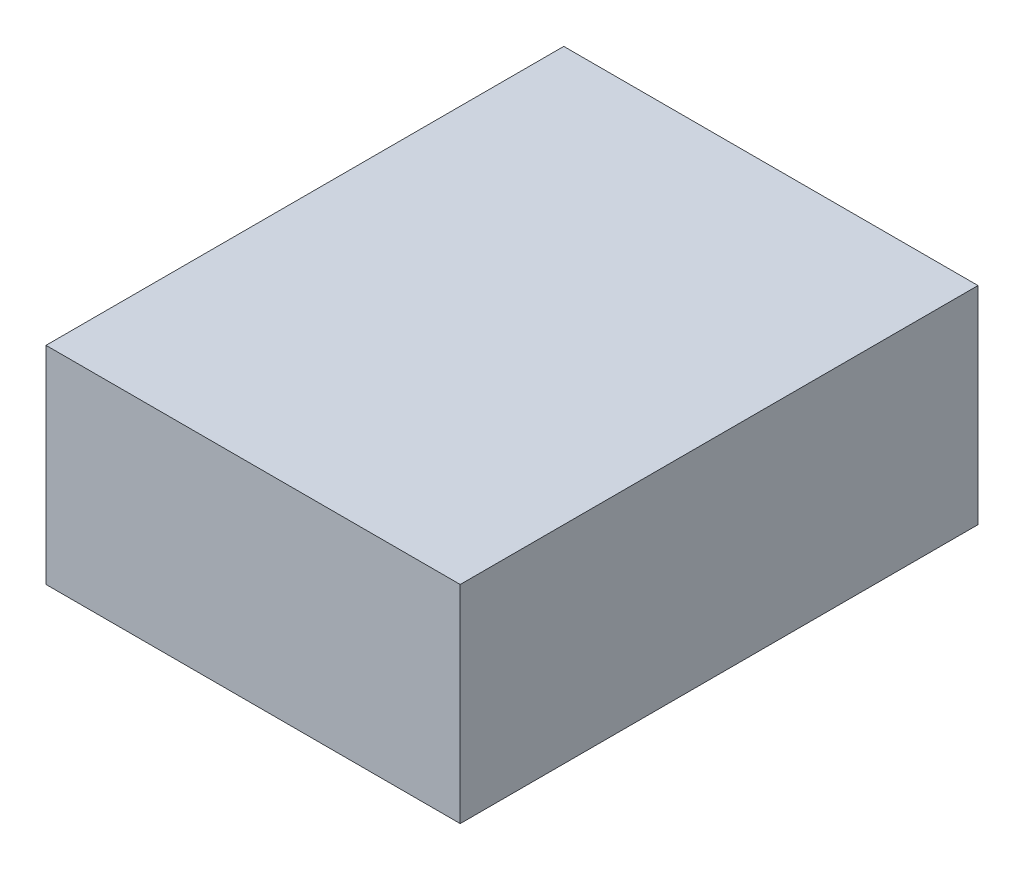
ISO-10303-21;
HEADER;
FILE_DESCRIPTION(('STEP AP214'),'2;1');
FILE_NAME('part.step','',(''),(''),'','','');
FILE_SCHEMA(('AUTOMOTIVE_DESIGN { 1 0 10303 214 1 1 1 1 }'));
ENDSEC;
DATA;
#1=APPLICATION_CONTEXT('core data for automotive mechanical design processes');
#2=APPLICATION_PROTOCOL_DEFINITION('international standard','automotive_design',2000,#1);
#3=PRODUCT_CONTEXT('',#1,'mechanical');
#4=PRODUCT('Part','Part','',(#3));
#5=PRODUCT_RELATED_PRODUCT_CATEGORY('part','',(#4));
#6=PRODUCT_DEFINITION_FORMATION('','',#4);
#7=PRODUCT_DEFINITION_CONTEXT('part definition',#1,'design');
#8=PRODUCT_DEFINITION('design','',#6,#7);
#9=PRODUCT_DEFINITION_SHAPE('','',#8);
#10=(LENGTH_UNIT() NAMED_UNIT(*) SI_UNIT(.MILLI.,.METRE.));
#11=(NAMED_UNIT(*) PLANE_ANGLE_UNIT() SI_UNIT($,.RADIAN.));
#12=(NAMED_UNIT(*) SI_UNIT($,.STERADIAN.) SOLID_ANGLE_UNIT());
#13=UNCERTAINTY_MEASURE_WITH_UNIT(LENGTH_MEASURE(1.E-05),#10,'distance_accuracy_value','');
#14=(GEOMETRIC_REPRESENTATION_CONTEXT(3) GLOBAL_UNCERTAINTY_ASSIGNED_CONTEXT((#13)) GLOBAL_UNIT_ASSIGNED_CONTEXT((#10,
#11,#12)) REPRESENTATION_CONTEXT('',''));
#15=CARTESIAN_POINT('',(0.,0.,0.));
#16=DIRECTION('',(0.,0.,1.));
#17=DIRECTION('',(1.,0.,0.));
#18=AXIS2_PLACEMENT_3D('',#15,#16,#17);
#19=CARTESIAN_POINT('',(0.,0.,127.));
#20=DIRECTION('',(1.,0.,0.));
#21=DIRECTION('',(0.,0.,-1.));
#22=AXIS2_PLACEMENT_3D('',#19,#20,#21);
#23=PLANE('',#22);
#24=DIRECTION('',(0.,-1.,0.));
#25=VECTOR('',#24,1.);
#26=CARTESIAN_POINT('',(0.,0.,0.));
#27=LINE('',#26,#25);
#28=CARTESIAN_POINT('',(0.,50.8,0.));
#29=VERTEX_POINT('',#28);
#30=CARTESIAN_POINT('',(0.,0.,0.));
#31=VERTEX_POINT('',#30);
#32=EDGE_CURVE('E100',#29,#31,#27,.T.);
#33=ORIENTED_EDGE('',*,*,#32,.T.);
#34=DIRECTION('',(0.,0.,-1.));
#35=VECTOR('',#34,1.);
#36=CARTESIAN_POINT('',(0.,0.,127.));
#37=LINE('',#36,#35);
#38=CARTESIAN_POINT('',(0.,0.,127.));
#39=VERTEX_POINT('',#38);
#40=EDGE_CURVE('E11',#39,#31,#37,.T.);
#41=ORIENTED_EDGE('',*,*,#40,.F.);
#42=DIRECTION('',(0.,-1.,0.));
#43=VECTOR('',#42,1.);
#44=CARTESIAN_POINT('',(0.,0.,127.));
#45=LINE('',#44,#43);
#46=CARTESIAN_POINT('',(0.,50.8,127.));
#47=VERTEX_POINT('',#46);
#48=EDGE_CURVE('E88',#47,#39,#45,.T.);
#49=ORIENTED_EDGE('',*,*,#48,.F.);
#50=DIRECTION('',(0.,0.,-1.));
#51=VECTOR('',#50,1.);
#52=CARTESIAN_POINT('',(0.,50.8,127.));
#53=LINE('',#52,#51);
#54=EDGE_CURVE('E96',#47,#29,#53,.T.);
#55=ORIENTED_EDGE('',*,*,#54,.T.);
#56=EDGE_LOOP('',(#33,#41,#49,#55));
#57=FACE_BOUND('',#56,.T.);
#58=ADVANCED_FACE('F37',(#57),#23,.F.);
#59=CARTESIAN_POINT('',(0.,0.,127.));
#60=DIRECTION('',(0.,1.,0.));
#61=DIRECTION('',(0.,0.,1.));
#62=AXIS2_PLACEMENT_3D('',#59,#60,#61);
#63=PLANE('',#62);
#64=DIRECTION('',(1.,0.,0.));
#65=VECTOR('',#64,1.);
#66=CARTESIAN_POINT('',(0.,0.,0.));
#67=LINE('',#66,#65);
#68=CARTESIAN_POINT('',(101.6,0.,0.));
#69=VERTEX_POINT('',#68);
#70=EDGE_CURVE('E92',#31,#69,#67,.T.);
#71=ORIENTED_EDGE('',*,*,#70,.T.);
#72=DIRECTION('',(0.,0.,-1.));
#73=VECTOR('',#72,1.);
#74=CARTESIAN_POINT('',(101.6,0.,127.));
#75=LINE('',#74,#73);
#76=CARTESIAN_POINT('',(101.6,0.,127.));
#77=VERTEX_POINT('',#76);
#78=EDGE_CURVE('E45',#77,#69,#75,.T.);
#79=ORIENTED_EDGE('',*,*,#78,.F.);
#80=DIRECTION('',(1.,0.,0.));
#81=VECTOR('',#80,1.);
#82=CARTESIAN_POINT('',(0.,0.,127.));
#83=LINE('',#82,#81);
#84=EDGE_CURVE('E83',#39,#77,#83,.T.);
#85=ORIENTED_EDGE('',*,*,#84,.F.);
#86=ORIENTED_EDGE('',*,*,#40,.T.);
#87=EDGE_LOOP('',(#71,#79,#85,#86));
#88=FACE_BOUND('',#87,.T.);
#89=ADVANCED_FACE('F91',(#88),#63,.F.);
#90=CARTESIAN_POINT('',(101.6,0.,127.));
#91=DIRECTION('',(-1.,0.,0.));
#92=DIRECTION('',(0.,0.,1.));
#93=AXIS2_PLACEMENT_3D('',#90,#91,#92);
#94=PLANE('',#93);
#95=DIRECTION('',(0.,1.,0.));
#96=VECTOR('',#95,1.);
#97=CARTESIAN_POINT('',(101.6,0.,0.));
#98=LINE('',#97,#96);
#99=CARTESIAN_POINT('',(101.6,50.8,0.));
#100=VERTEX_POINT('',#99);
#101=EDGE_CURVE('E70',#69,#100,#98,.T.);
#102=ORIENTED_EDGE('',*,*,#101,.T.);
#103=DIRECTION('',(0.,0.,-1.));
#104=VECTOR('',#103,1.);
#105=CARTESIAN_POINT('',(101.6,50.8,127.));
#106=LINE('',#105,#104);
#107=CARTESIAN_POINT('',(101.6,50.8,127.));
#108=VERTEX_POINT('',#107);
#109=EDGE_CURVE('E93',#108,#100,#106,.T.);
#110=ORIENTED_EDGE('',*,*,#109,.F.);
#111=DIRECTION('',(0.,1.,0.));
#112=VECTOR('',#111,1.);
#113=CARTESIAN_POINT('',(101.6,0.,127.));
#114=LINE('',#113,#112);
#115=EDGE_CURVE('E86',#77,#108,#114,.T.);
#116=ORIENTED_EDGE('',*,*,#115,.F.);
#117=ORIENTED_EDGE('',*,*,#78,.T.);
#118=EDGE_LOOP('',(#102,#110,#116,#117));
#119=FACE_BOUND('',#118,.T.);
#120=ADVANCED_FACE('F94',(#119),#94,.F.);
#121=CARTESIAN_POINT('',(0.,50.8,127.));
#122=DIRECTION('',(0.,-1.,0.));
#123=DIRECTION('',(0.,0.,-1.));
#124=AXIS2_PLACEMENT_3D('',#121,#122,#123);
#125=PLANE('',#124);
#126=DIRECTION('',(-1.,0.,0.));
#127=VECTOR('',#126,1.);
#128=CARTESIAN_POINT('',(0.,50.8,0.));
#129=LINE('',#128,#127);
#130=EDGE_CURVE('E76',#100,#29,#129,.T.);
#131=ORIENTED_EDGE('',*,*,#130,.T.);
#132=ORIENTED_EDGE('',*,*,#54,.F.);
#133=DIRECTION('',(-1.,0.,0.));
#134=VECTOR('',#133,1.);
#135=CARTESIAN_POINT('',(0.,50.8,127.));
#136=LINE('',#135,#134);
#137=EDGE_CURVE('E53',#108,#47,#136,.T.);
#138=ORIENTED_EDGE('',*,*,#137,.F.);
#139=ORIENTED_EDGE('',*,*,#109,.T.);
#140=EDGE_LOOP('',(#131,#132,#138,#139));
#141=FACE_BOUND('',#140,.T.);
#142=ADVANCED_FACE('F107',(#141),#125,.F.);
#143=CARTESIAN_POINT('',(0.,0.,127.));
#144=DIRECTION('',(0.,0.,-1.));
#145=DIRECTION('',(-1.,0.,0.));
#146=AXIS2_PLACEMENT_3D('',#143,#144,#145);
#147=PLANE('',#146);
#148=ORIENTED_EDGE('',*,*,#48,.T.);
#149=ORIENTED_EDGE('',*,*,#84,.T.);
#150=ORIENTED_EDGE('',*,*,#115,.T.);
#151=ORIENTED_EDGE('',*,*,#137,.T.);
#152=EDGE_LOOP('',(#148,#149,#150,#151));
#153=FACE_BOUND('',#152,.T.);
#154=ADVANCED_FACE('F84',(#153),#147,.F.);
#155=CARTESIAN_POINT('',(0.,0.,0.));
#156=DIRECTION('',(0.,0.,-1.));
#157=DIRECTION('',(-1.,0.,0.));
#158=AXIS2_PLACEMENT_3D('',#155,#156,#157);
#159=PLANE('',#158);
#160=ORIENTED_EDGE('',*,*,#32,.F.);
#161=ORIENTED_EDGE('',*,*,#130,.F.);
#162=ORIENTED_EDGE('',*,*,#101,.F.);
#163=ORIENTED_EDGE('',*,*,#70,.F.);
#164=EDGE_LOOP('',(#160,#161,#162,#163));
#165=FACE_BOUND('',#164,.T.);
#166=ADVANCED_FACE('F110',(#165),#159,.T.);
#167=CLOSED_SHELL('',(#58,#89,#120,#142,#154,#166));
#168=MANIFOLD_SOLID_BREP('B2',#167);
#169=ADVANCED_BREP_SHAPE_REPRESENTATION('',(#18,#168),#14);
#170=SHAPE_DEFINITION_REPRESENTATION(#9,#169);
ENDSEC;
END-ISO-10303-21;
